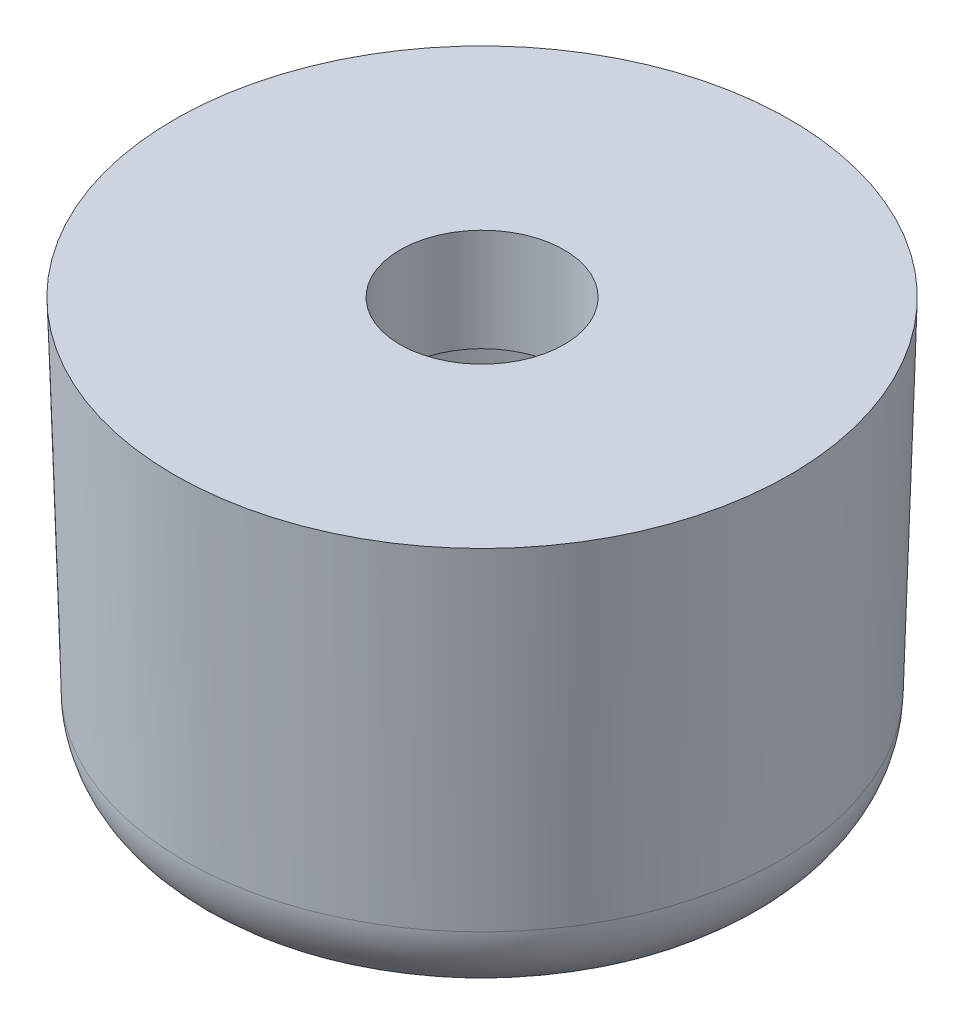
ISO-10303-21;
HEADER;
FILE_DESCRIPTION(('STEP AP214'),'2;1');
FILE_NAME('part.step','',(''),(''),'','','');
FILE_SCHEMA(('AUTOMOTIVE_DESIGN { 1 0 10303 214 1 1 1 1 }'));
ENDSEC;
DATA;
#1=APPLICATION_CONTEXT('core data for automotive mechanical design processes');
#2=APPLICATION_PROTOCOL_DEFINITION('international standard','automotive_design',2000,#1);
#3=PRODUCT_CONTEXT('',#1,'mechanical');
#4=PRODUCT('Part','Part','',(#3));
#5=PRODUCT_RELATED_PRODUCT_CATEGORY('part','',(#4));
#6=PRODUCT_DEFINITION_FORMATION('','',#4);
#7=PRODUCT_DEFINITION_CONTEXT('part definition',#1,'design');
#8=PRODUCT_DEFINITION('design','',#6,#7);
#9=PRODUCT_DEFINITION_SHAPE('','',#8);
#10=(LENGTH_UNIT() NAMED_UNIT(*) SI_UNIT(.MILLI.,.METRE.));
#11=(NAMED_UNIT(*) PLANE_ANGLE_UNIT() SI_UNIT($,.RADIAN.));
#12=(NAMED_UNIT(*) SI_UNIT($,.STERADIAN.) SOLID_ANGLE_UNIT());
#13=UNCERTAINTY_MEASURE_WITH_UNIT(LENGTH_MEASURE(1.E-05),#10,'distance_accuracy_value','');
#14=(GEOMETRIC_REPRESENTATION_CONTEXT(3) GLOBAL_UNCERTAINTY_ASSIGNED_CONTEXT((#13)) GLOBAL_UNIT_ASSIGNED_CONTEXT((#10,
#11,#12)) REPRESENTATION_CONTEXT('',''));
#15=CARTESIAN_POINT('',(0.,0.,0.));
#16=DIRECTION('',(0.,0.,1.));
#17=DIRECTION('',(1.,0.,0.));
#18=AXIS2_PLACEMENT_3D('',#15,#16,#17);
#19=CARTESIAN_POINT('',(0.,1.26646728652624,0.));
#20=DIRECTION('',(0.,1.,0.));
#21=DIRECTION('',(0.,0.,1.));
#22=AXIS2_PLACEMENT_3D('',#19,#20,#21);
#23=TOROIDAL_SURFACE('',#22,3.34223408975786,1.26646728652624);
#24=CARTESIAN_POINT('',(0.,1.22923434941755,0.));
#25=DIRECTION('',(0.,1.,0.));
#26=DIRECTION('',(0.,0.,1.));
#27=AXIS2_PLACEMENT_3D('',#24,#25,#26);
#28=CIRCLE('',#27,4.60815395145346);
#29=CARTESIAN_POINT('',(0.,1.22923434941755,4.60815395145346));
#30=VERTEX_POINT('',#29);
#31=EDGE_CURVE('E52',#30,#30,#28,.T.);
#32=ORIENTED_EDGE('',*,*,#31,.F.);
#33=EDGE_LOOP('',(#32));
#34=FACE_BOUND('',#33,.T.);
#35=CARTESIAN_POINT('',(0.,0.,0.));
#36=DIRECTION('',(0.,1.,0.));
#37=DIRECTION('',(0.,0.,1.));
#38=AXIS2_PLACEMENT_3D('',#35,#36,#37);
#39=CIRCLE('',#38,3.34223408975785);
#40=CARTESIAN_POINT('',(0.,0.,3.34223408975785));
#41=VERTEX_POINT('',#40);
#42=EDGE_CURVE('E10',#41,#41,#39,.T.);
#43=ORIENTED_EDGE('',*,*,#42,.T.);
#44=EDGE_LOOP('',(#43));
#45=FACE_BOUND('',#44,.T.);
#46=ADVANCED_FACE('F30',(#34,#45),#23,.T.);
#47=CARTESIAN_POINT('',(0.,4.8895,0.));
#48=DIRECTION('',(0.,-1.,0.));
#49=DIRECTION('',(0.,0.,-1.));
#50=AXIS2_PLACEMENT_3D('',#47,#48,#49);
#51=CONICAL_SURFACE('',#50,3.20309581684554,0.0284488668075021);
#52=ORIENTED_EDGE('',*,*,#42,.F.);
#53=EDGE_LOOP('',(#52));
#54=FACE_BOUND('',#53,.T.);
#55=CARTESIAN_POINT('',(0.,4.8895,0.));
#56=DIRECTION('',(0.,1.,0.));
#57=DIRECTION('',(0.,0.,1.));
#58=AXIS2_PLACEMENT_3D('',#55,#56,#57);
#59=CIRCLE('',#58,3.20309581684554);
#60=CARTESIAN_POINT('',(0.,4.8895,3.20309581684554));
#61=VERTEX_POINT('',#60);
#62=EDGE_CURVE('E36',#61,#61,#59,.T.);
#63=ORIENTED_EDGE('',*,*,#62,.T.);
#64=EDGE_LOOP('',(#63));
#65=FACE_BOUND('',#64,.T.);
#66=ADVANCED_FACE('F59',(#54,#65),#51,.F.);
#67=CARTESIAN_POINT('',(0.,4.8895,-3.20309581684554));
#68=DIRECTION('',(0.,1.,0.));
#69=DIRECTION('',(0.,0.,1.));
#70=AXIS2_PLACEMENT_3D('',#67,#68,#69);
#71=PLANE('',#70);
#72=ORIENTED_EDGE('',*,*,#62,.F.);
#73=EDGE_LOOP('',(#72));
#74=FACE_BOUND('',#73,.T.);
#75=CARTESIAN_POINT('',(0.,4.8895,0.));
#76=DIRECTION('',(0.,1.,0.));
#77=DIRECTION('',(0.,0.,1.));
#78=AXIS2_PLACEMENT_3D('',#75,#76,#77);
#79=CIRCLE('',#78,1.27);
#80=CARTESIAN_POINT('',(0.,4.8895,1.27));
#81=VERTEX_POINT('',#80);
#82=EDGE_CURVE('E40',#81,#81,#79,.T.);
#83=ORIENTED_EDGE('',*,*,#82,.T.);
#84=EDGE_LOOP('',(#83));
#85=FACE_BOUND('',#84,.T.);
#86=ADVANCED_FACE('F63',(#74,#85),#71,.F.);
#87=CARTESIAN_POINT('',(0.,6.477,0.));
#88=DIRECTION('',(0.,1.,0.));
#89=DIRECTION('',(0.,0.,1.));
#90=AXIS2_PLACEMENT_3D('',#87,#88,#89);
#91=CYLINDRICAL_SURFACE('',#90,1.27);
#92=ORIENTED_EDGE('',*,*,#82,.F.);
#93=EDGE_LOOP('',(#92));
#94=FACE_BOUND('',#93,.T.);
#95=CARTESIAN_POINT('',(0.,6.477,0.));
#96=DIRECTION('',(0.,1.,0.));
#97=DIRECTION('',(0.,0.,1.));
#98=AXIS2_PLACEMENT_3D('',#95,#96,#97);
#99=CIRCLE('',#98,1.27);
#100=CARTESIAN_POINT('',(0.,6.477,1.27));
#101=VERTEX_POINT('',#100);
#102=EDGE_CURVE('E44',#101,#101,#99,.T.);
#103=ORIENTED_EDGE('',*,*,#102,.T.);
#104=EDGE_LOOP('',(#103));
#105=FACE_BOUND('',#104,.T.);
#106=ADVANCED_FACE('F68',(#94,#105),#91,.F.);
#107=CARTESIAN_POINT('',(0.,6.477,-1.27));
#108=DIRECTION('',(0.,-1.,0.));
#109=DIRECTION('',(0.,0.,-1.));
#110=AXIS2_PLACEMENT_3D('',#107,#108,#109);
#111=PLANE('',#110);
#112=ORIENTED_EDGE('',*,*,#102,.F.);
#113=EDGE_LOOP('',(#112));
#114=FACE_BOUND('',#113,.T.);
#115=CARTESIAN_POINT('',(0.,6.477,0.));
#116=DIRECTION('',(0.,1.,0.));
#117=DIRECTION('',(0.,0.,1.));
#118=AXIS2_PLACEMENT_3D('',#115,#116,#117);
#119=CIRCLE('',#118,4.7625);
#120=CARTESIAN_POINT('',(0.,6.477,4.7625));
#121=VERTEX_POINT('',#120);
#122=EDGE_CURVE('E49',#121,#121,#119,.T.);
#123=ORIENTED_EDGE('',*,*,#122,.T.);
#124=EDGE_LOOP('',(#123));
#125=FACE_BOUND('',#124,.T.);
#126=ADVANCED_FACE('F74',(#114,#125),#111,.F.);
#127=CARTESIAN_POINT('',(0.,1.22923434941755,0.));
#128=DIRECTION('',(0.,1.,0.));
#129=DIRECTION('',(0.,0.,1.));
#130=AXIS2_PLACEMENT_3D('',#127,#128,#129);
#131=CONICAL_SURFACE('',#130,4.60815395145346,0.0294032882040052);
#132=ORIENTED_EDGE('',*,*,#122,.F.);
#133=EDGE_LOOP('',(#132));
#134=FACE_BOUND('',#133,.T.);
#135=ORIENTED_EDGE('',*,*,#31,.T.);
#136=EDGE_LOOP('',(#135));
#137=FACE_BOUND('',#136,.T.);
#138=ADVANCED_FACE('F56',(#134,#137),#131,.T.);
#139=CLOSED_SHELL('',(#46,#66,#86,#106,#126,#138));
#140=MANIFOLD_SOLID_BREP('B2',#139);
#141=ADVANCED_BREP_SHAPE_REPRESENTATION('',(#18,#140),#14);
#142=SHAPE_DEFINITION_REPRESENTATION(#9,#141);
ENDSEC;
END-ISO-10303-21;
